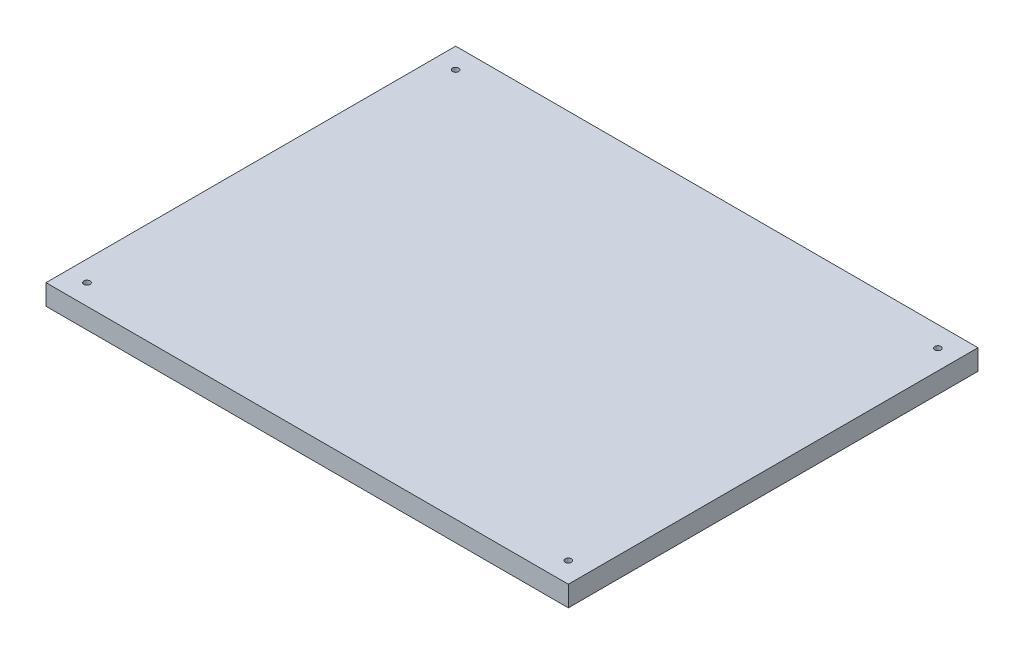
ISO-10303-21;
HEADER;
FILE_DESCRIPTION(('STEP AP214'),'2;1');
FILE_NAME('part.step','',(''),(''),'','','');
FILE_SCHEMA(('AUTOMOTIVE_DESIGN { 1 0 10303 214 1 1 1 1 }'));
ENDSEC;
DATA;
#1=APPLICATION_CONTEXT('core data for automotive mechanical design processes');
#2=APPLICATION_PROTOCOL_DEFINITION('international standard','automotive_design',2000,#1);
#3=PRODUCT_CONTEXT('',#1,'mechanical');
#4=PRODUCT('Part','Part','',(#3));
#5=PRODUCT_RELATED_PRODUCT_CATEGORY('part','',(#4));
#6=PRODUCT_DEFINITION_FORMATION('','',#4);
#7=PRODUCT_DEFINITION_CONTEXT('part definition',#1,'design');
#8=PRODUCT_DEFINITION('design','',#6,#7);
#9=PRODUCT_DEFINITION_SHAPE('','',#8);
#10=(LENGTH_UNIT() NAMED_UNIT(*) SI_UNIT(.MILLI.,.METRE.));
#11=(NAMED_UNIT(*) PLANE_ANGLE_UNIT() SI_UNIT($,.RADIAN.));
#12=(NAMED_UNIT(*) SI_UNIT($,.STERADIAN.) SOLID_ANGLE_UNIT());
#13=UNCERTAINTY_MEASURE_WITH_UNIT(LENGTH_MEASURE(1.E-05),#10,'distance_accuracy_value','');
#14=(GEOMETRIC_REPRESENTATION_CONTEXT(3) GLOBAL_UNCERTAINTY_ASSIGNED_CONTEXT((#13)) GLOBAL_UNIT_ASSIGNED_CONTEXT((#10,
#11,#12)) REPRESENTATION_CONTEXT('',''));
#15=CARTESIAN_POINT('',(0.,0.,0.));
#16=DIRECTION('',(0.,0.,1.));
#17=DIRECTION('',(1.,0.,0.));
#18=AXIS2_PLACEMENT_3D('',#15,#16,#17);
#19=CARTESIAN_POINT('',(127.5,10.,-100.));
#20=DIRECTION('',(0.,-1.,0.));
#21=DIRECTION('',(0.,0.,-1.));
#22=AXIS2_PLACEMENT_3D('',#19,#20,#21);
#23=PLANE('',#22);
#24=CARTESIAN_POINT('',(117.5,10.,90.));
#25=DIRECTION('',(0.,-1.,0.));
#26=DIRECTION('',(0.,0.,-1.));
#27=AXIS2_PLACEMENT_3D('',#24,#25,#26);
#28=CIRCLE('',#27,1.5);
#29=CARTESIAN_POINT('',(117.5,10.,88.5));
#30=VERTEX_POINT('',#29);
#31=EDGE_CURVE('E116',#30,#30,#28,.F.);
#32=ORIENTED_EDGE('',*,*,#31,.F.);
#33=EDGE_LOOP('',(#32));
#34=FACE_BOUND('',#33,.T.);
#35=CARTESIAN_POINT('',(-117.5,10.,-90.));
#36=DIRECTION('',(0.,-1.,0.));
#37=DIRECTION('',(0.,0.,-1.));
#38=AXIS2_PLACEMENT_3D('',#35,#36,#37);
#39=CIRCLE('',#38,1.5);
#40=CARTESIAN_POINT('',(-117.5,10.,-91.5));
#41=VERTEX_POINT('',#40);
#42=EDGE_CURVE('E104',#41,#41,#39,.F.);
#43=ORIENTED_EDGE('',*,*,#42,.F.);
#44=EDGE_LOOP('',(#43));
#45=FACE_BOUND('',#44,.T.);
#46=DIRECTION('',(0.,0.,-1.));
#47=VECTOR('',#46,1.);
#48=CARTESIAN_POINT('',(127.5,10.,100.));
#49=LINE('',#48,#47);
#50=CARTESIAN_POINT('',(127.5,10.,100.));
#51=VERTEX_POINT('',#50);
#52=CARTESIAN_POINT('',(127.5,10.,-100.));
#53=VERTEX_POINT('',#52);
#54=EDGE_CURVE('E88',#51,#53,#49,.T.);
#55=ORIENTED_EDGE('',*,*,#54,.T.);
#56=DIRECTION('',(-1.,0.,0.));
#57=VECTOR('',#56,1.);
#58=CARTESIAN_POINT('',(-127.5,10.,-100.));
#59=LINE('',#58,#57);
#60=CARTESIAN_POINT('',(-127.5,10.,-100.));
#61=VERTEX_POINT('',#60);
#62=EDGE_CURVE('E83',#53,#61,#59,.T.);
#63=ORIENTED_EDGE('',*,*,#62,.T.);
#64=DIRECTION('',(0.,0.,1.));
#65=VECTOR('',#64,1.);
#66=CARTESIAN_POINT('',(-127.5,10.,100.));
#67=LINE('',#66,#65);
#68=CARTESIAN_POINT('',(-127.5,10.,100.));
#69=VERTEX_POINT('',#68);
#70=EDGE_CURVE('E86',#61,#69,#67,.T.);
#71=ORIENTED_EDGE('',*,*,#70,.T.);
#72=DIRECTION('',(1.,0.,0.));
#73=VECTOR('',#72,1.);
#74=CARTESIAN_POINT('',(-127.5,10.,100.));
#75=LINE('',#74,#73);
#76=EDGE_CURVE('E53',#69,#51,#75,.T.);
#77=ORIENTED_EDGE('',*,*,#76,.T.);
#78=EDGE_LOOP('',(#55,#63,#71,#77));
#79=FACE_BOUND('',#78,.T.);
#80=CARTESIAN_POINT('',(117.904272166402,10.,-90.));
#81=DIRECTION('',(0.,-1.,0.));
#82=DIRECTION('',(0.,0.,-1.));
#83=AXIS2_PLACEMENT_3D('',#80,#81,#82);
#84=CIRCLE('',#83,1.5);
#85=CARTESIAN_POINT('',(117.904272166402,10.,-91.5));
#86=VERTEX_POINT('',#85);
#87=EDGE_CURVE('E113',#86,#86,#84,.F.);
#88=ORIENTED_EDGE('',*,*,#87,.F.);
#89=EDGE_LOOP('',(#88));
#90=FACE_BOUND('',#89,.T.);
#91=CARTESIAN_POINT('',(-117.5,10.,90.));
#92=DIRECTION('',(0.,-1.,0.));
#93=DIRECTION('',(0.,0.,-1.));
#94=AXIS2_PLACEMENT_3D('',#91,#92,#93);
#95=CIRCLE('',#94,1.5);
#96=CARTESIAN_POINT('',(-117.5,10.,88.5));
#97=VERTEX_POINT('',#96);
#98=EDGE_CURVE('E119',#97,#97,#95,.F.);
#99=ORIENTED_EDGE('',*,*,#98,.F.);
#100=EDGE_LOOP('',(#99));
#101=FACE_BOUND('',#100,.T.);
#102=ADVANCED_FACE('F34',(#34,#45,#79,#90,#101),#23,.F.);
#103=CARTESIAN_POINT('',(127.5,0.,-100.));
#104=DIRECTION('',(0.,-1.,0.));
#105=DIRECTION('',(0.,0.,-1.));
#106=AXIS2_PLACEMENT_3D('',#103,#104,#105);
#107=PLANE('',#106);
#108=CARTESIAN_POINT('',(117.5,0.,90.));
#109=DIRECTION('',(0.,-1.,0.));
#110=DIRECTION('',(0.,0.,-1.));
#111=AXIS2_PLACEMENT_3D('',#108,#109,#110);
#112=CIRCLE('',#111,1.5);
#113=CARTESIAN_POINT('',(117.5,0.,88.5));
#114=VERTEX_POINT('',#113);
#115=EDGE_CURVE('E117',#114,#114,#112,.F.);
#116=ORIENTED_EDGE('',*,*,#115,.T.);
#117=EDGE_LOOP('',(#116));
#118=FACE_BOUND('',#117,.T.);
#119=CARTESIAN_POINT('',(-117.5,0.,-90.));
#120=DIRECTION('',(0.,-1.,0.));
#121=DIRECTION('',(0.,0.,-1.));
#122=AXIS2_PLACEMENT_3D('',#119,#120,#121);
#123=CIRCLE('',#122,1.5);
#124=CARTESIAN_POINT('',(-117.5,0.,-91.5));
#125=VERTEX_POINT('',#124);
#126=EDGE_CURVE('E110',#125,#125,#123,.F.);
#127=ORIENTED_EDGE('',*,*,#126,.T.);
#128=EDGE_LOOP('',(#127));
#129=FACE_BOUND('',#128,.T.);
#130=DIRECTION('',(0.,0.,-1.));
#131=VECTOR('',#130,1.);
#132=CARTESIAN_POINT('',(127.5,0.,100.));
#133=LINE('',#132,#131);
#134=CARTESIAN_POINT('',(127.5,0.,100.));
#135=VERTEX_POINT('',#134);
#136=CARTESIAN_POINT('',(127.5,0.,-100.));
#137=VERTEX_POINT('',#136);
#138=EDGE_CURVE('E101',#135,#137,#133,.T.);
#139=ORIENTED_EDGE('',*,*,#138,.F.);
#140=DIRECTION('',(1.,0.,0.));
#141=VECTOR('',#140,1.);
#142=CARTESIAN_POINT('',(-127.5,0.,100.));
#143=LINE('',#142,#141);
#144=CARTESIAN_POINT('',(-127.5,0.,100.));
#145=VERTEX_POINT('',#144);
#146=EDGE_CURVE('E76',#145,#135,#143,.T.);
#147=ORIENTED_EDGE('',*,*,#146,.F.);
#148=DIRECTION('',(0.,0.,1.));
#149=VECTOR('',#148,1.);
#150=CARTESIAN_POINT('',(-127.5,0.,100.));
#151=LINE('',#150,#149);
#152=CARTESIAN_POINT('',(-127.5,0.,-100.));
#153=VERTEX_POINT('',#152);
#154=EDGE_CURVE('E70',#153,#145,#151,.T.);
#155=ORIENTED_EDGE('',*,*,#154,.F.);
#156=DIRECTION('',(-1.,0.,0.));
#157=VECTOR('',#156,1.);
#158=CARTESIAN_POINT('',(-127.5,0.,-100.));
#159=LINE('',#158,#157);
#160=EDGE_CURVE('E92',#137,#153,#159,.T.);
#161=ORIENTED_EDGE('',*,*,#160,.F.);
#162=EDGE_LOOP('',(#139,#147,#155,#161));
#163=FACE_BOUND('',#162,.T.);
#164=CARTESIAN_POINT('',(117.904272166402,0.,-90.));
#165=DIRECTION('',(0.,-1.,0.));
#166=DIRECTION('',(0.,0.,-1.));
#167=AXIS2_PLACEMENT_3D('',#164,#165,#166);
#168=CIRCLE('',#167,1.5);
#169=CARTESIAN_POINT('',(117.904272166402,0.,-91.5));
#170=VERTEX_POINT('',#169);
#171=EDGE_CURVE('E114',#170,#170,#168,.F.);
#172=ORIENTED_EDGE('',*,*,#171,.T.);
#173=EDGE_LOOP('',(#172));
#174=FACE_BOUND('',#173,.T.);
#175=CARTESIAN_POINT('',(-117.5,0.,90.));
#176=DIRECTION('',(0.,-1.,0.));
#177=DIRECTION('',(0.,0.,-1.));
#178=AXIS2_PLACEMENT_3D('',#175,#176,#177);
#179=CIRCLE('',#178,1.5);
#180=CARTESIAN_POINT('',(-117.5,0.,88.5));
#181=VERTEX_POINT('',#180);
#182=EDGE_CURVE('E38',#181,#181,#179,.F.);
#183=ORIENTED_EDGE('',*,*,#182,.T.);
#184=EDGE_LOOP('',(#183));
#185=FACE_BOUND('',#184,.T.);
#186=ADVANCED_FACE('F138',(#118,#129,#163,#174,#185),#107,.T.);
#187=CARTESIAN_POINT('',(127.5,10.,100.));
#188=DIRECTION('',(-1.,0.,0.));
#189=DIRECTION('',(0.,0.,1.));
#190=AXIS2_PLACEMENT_3D('',#187,#188,#189);
#191=PLANE('',#190);
#192=ORIENTED_EDGE('',*,*,#138,.T.);
#193=DIRECTION('',(0.,-1.,0.));
#194=VECTOR('',#193,1.);
#195=CARTESIAN_POINT('',(127.5,10.,-100.));
#196=LINE('',#195,#194);
#197=EDGE_CURVE('E11',#53,#137,#196,.T.);
#198=ORIENTED_EDGE('',*,*,#197,.F.);
#199=ORIENTED_EDGE('',*,*,#54,.F.);
#200=DIRECTION('',(0.,-1.,0.));
#201=VECTOR('',#200,1.);
#202=CARTESIAN_POINT('',(127.5,10.,100.));
#203=LINE('',#202,#201);
#204=EDGE_CURVE('E97',#51,#135,#203,.T.);
#205=ORIENTED_EDGE('',*,*,#204,.T.);
#206=EDGE_LOOP('',(#192,#198,#199,#205));
#207=FACE_BOUND('',#206,.T.);
#208=ADVANCED_FACE('F36',(#207),#191,.F.);
#209=CARTESIAN_POINT('',(-127.5,10.,-100.));
#210=DIRECTION('',(0.,0.,1.));
#211=DIRECTION('',(1.,0.,0.));
#212=AXIS2_PLACEMENT_3D('',#209,#210,#211);
#213=PLANE('',#212);
#214=ORIENTED_EDGE('',*,*,#160,.T.);
#215=DIRECTION('',(0.,-1.,0.));
#216=VECTOR('',#215,1.);
#217=CARTESIAN_POINT('',(-127.5,10.,-100.));
#218=LINE('',#217,#216);
#219=EDGE_CURVE('E44',#61,#153,#218,.T.);
#220=ORIENTED_EDGE('',*,*,#219,.F.);
#221=ORIENTED_EDGE('',*,*,#62,.F.);
#222=ORIENTED_EDGE('',*,*,#197,.T.);
#223=EDGE_LOOP('',(#214,#220,#221,#222));
#224=FACE_BOUND('',#223,.T.);
#225=ADVANCED_FACE('F91',(#224),#213,.F.);
#226=CARTESIAN_POINT('',(-127.5,10.,100.));
#227=DIRECTION('',(1.,0.,0.));
#228=DIRECTION('',(0.,0.,-1.));
#229=AXIS2_PLACEMENT_3D('',#226,#227,#228);
#230=PLANE('',#229);
#231=ORIENTED_EDGE('',*,*,#154,.T.);
#232=DIRECTION('',(0.,-1.,0.));
#233=VECTOR('',#232,1.);
#234=CARTESIAN_POINT('',(-127.5,10.,100.));
#235=LINE('',#234,#233);
#236=EDGE_CURVE('E93',#69,#145,#235,.T.);
#237=ORIENTED_EDGE('',*,*,#236,.F.);
#238=ORIENTED_EDGE('',*,*,#70,.F.);
#239=ORIENTED_EDGE('',*,*,#219,.T.);
#240=EDGE_LOOP('',(#231,#237,#238,#239));
#241=FACE_BOUND('',#240,.T.);
#242=ADVANCED_FACE('F95',(#241),#230,.F.);
#243=CARTESIAN_POINT('',(-127.5,10.,100.));
#244=DIRECTION('',(0.,0.,-1.));
#245=DIRECTION('',(-1.,0.,0.));
#246=AXIS2_PLACEMENT_3D('',#243,#244,#245);
#247=PLANE('',#246);
#248=ORIENTED_EDGE('',*,*,#146,.T.);
#249=ORIENTED_EDGE('',*,*,#204,.F.);
#250=ORIENTED_EDGE('',*,*,#76,.F.);
#251=ORIENTED_EDGE('',*,*,#236,.T.);
#252=EDGE_LOOP('',(#248,#249,#250,#251));
#253=FACE_BOUND('',#252,.T.);
#254=ADVANCED_FACE('F149',(#253),#247,.F.);
#255=CARTESIAN_POINT('',(-117.5,26.,-90.));
#256=DIRECTION('',(0.,-1.,0.));
#257=DIRECTION('',(0.,0.,-1.));
#258=AXIS2_PLACEMENT_3D('',#255,#256,#257);
#259=CYLINDRICAL_SURFACE('',#258,1.5);
#260=CARTESIAN_POINT('',(-117.5,0.,-91.5));
#261=CARTESIAN_POINT('',(-117.5,0.104166666666667,-91.5));
#262=CARTESIAN_POINT('',(-117.5,0.208333333333334,-91.5));
#263=CARTESIAN_POINT('',(-117.5,0.416666666666667,-91.5));
#264=CARTESIAN_POINT('',(-117.5,0.520833333333334,-91.5));
#265=CARTESIAN_POINT('',(-117.5,0.729166666666667,-91.5));
#266=CARTESIAN_POINT('',(-117.5,0.833333333333334,-91.5));
#267=CARTESIAN_POINT('',(-117.5,1.04166666666667,-91.5));
#268=CARTESIAN_POINT('',(-117.5,1.14583333333333,-91.5));
#269=CARTESIAN_POINT('',(-117.5,1.35416666666667,-91.5));
#270=CARTESIAN_POINT('',(-117.5,1.45833333333333,-91.5));
#271=CARTESIAN_POINT('',(-117.5,1.66666666666667,-91.5));
#272=CARTESIAN_POINT('',(-117.5,1.77083333333334,-91.5));
#273=CARTESIAN_POINT('',(-117.5,1.97916666666667,-91.5));
#274=CARTESIAN_POINT('',(-117.5,2.08333333333334,-91.5));
#275=CARTESIAN_POINT('',(-117.5,2.29166666666667,-91.5));
#276=CARTESIAN_POINT('',(-117.5,2.39583333333334,-91.5));
#277=CARTESIAN_POINT('',(-117.5,2.60416666666667,-91.5));
#278=CARTESIAN_POINT('',(-117.5,2.70833333333334,-91.5));
#279=CARTESIAN_POINT('',(-117.5,2.91666666666667,-91.5));
#280=CARTESIAN_POINT('',(-117.5,3.02083333333333,-91.5));
#281=CARTESIAN_POINT('',(-117.5,3.22916666666667,-91.5));
#282=CARTESIAN_POINT('',(-117.5,3.33333333333333,-91.5));
#283=CARTESIAN_POINT('',(-117.5,3.54166666666667,-91.5));
#284=CARTESIAN_POINT('',(-117.5,3.64583333333333,-91.5));
#285=CARTESIAN_POINT('',(-117.5,3.85416666666667,-91.5));
#286=CARTESIAN_POINT('',(-117.5,3.95833333333333,-91.5));
#287=CARTESIAN_POINT('',(-117.5,4.16666666666667,-91.5));
#288=CARTESIAN_POINT('',(-117.5,4.27083333333333,-91.5));
#289=CARTESIAN_POINT('',(-117.5,4.47916666666667,-91.5));
#290=CARTESIAN_POINT('',(-117.5,4.58333333333333,-91.5));
#291=CARTESIAN_POINT('',(-117.5,4.79166666666667,-91.5));
#292=CARTESIAN_POINT('',(-117.5,4.89583333333333,-91.5));
#293=CARTESIAN_POINT('',(-117.5,5.10416666666667,-91.5));
#294=CARTESIAN_POINT('',(-117.5,5.20833333333333,-91.5));
#295=CARTESIAN_POINT('',(-117.5,5.41666666666667,-91.5));
#296=CARTESIAN_POINT('',(-117.5,5.52083333333333,-91.5));
#297=CARTESIAN_POINT('',(-117.5,5.72916666666667,-91.5));
#298=CARTESIAN_POINT('',(-117.5,5.83333333333334,-91.5));
#299=CARTESIAN_POINT('',(-117.5,6.04166666666667,-91.5));
#300=CARTESIAN_POINT('',(-117.5,6.14583333333334,-91.5));
#301=CARTESIAN_POINT('',(-117.5,6.35416666666667,-91.5));
#302=CARTESIAN_POINT('',(-117.5,6.45833333333334,-91.5));
#303=CARTESIAN_POINT('',(-117.5,6.66666666666667,-91.5));
#304=CARTESIAN_POINT('',(-117.5,6.77083333333333,-91.5));
#305=CARTESIAN_POINT('',(-117.5,6.97916666666667,-91.5));
#306=CARTESIAN_POINT('',(-117.5,7.08333333333333,-91.5));
#307=CARTESIAN_POINT('',(-117.5,7.29166666666667,-91.5));
#308=CARTESIAN_POINT('',(-117.5,7.39583333333333,-91.5));
#309=CARTESIAN_POINT('',(-117.5,7.60416666666667,-91.5));
#310=CARTESIAN_POINT('',(-117.5,7.70833333333333,-91.5));
#311=CARTESIAN_POINT('',(-117.5,7.91666666666667,-91.5));
#312=CARTESIAN_POINT('',(-117.5,8.02083333333333,-91.5));
#313=CARTESIAN_POINT('',(-117.5,8.22916666666667,-91.5));
#314=CARTESIAN_POINT('',(-117.5,8.33333333333333,-91.5));
#315=CARTESIAN_POINT('',(-117.5,8.54166666666667,-91.5));
#316=CARTESIAN_POINT('',(-117.5,8.64583333333333,-91.5));
#317=CARTESIAN_POINT('',(-117.5,8.85416666666667,-91.5));
#318=CARTESIAN_POINT('',(-117.5,8.95833333333333,-91.5));
#319=CARTESIAN_POINT('',(-117.5,9.16666666666667,-91.5));
#320=CARTESIAN_POINT('',(-117.5,9.27083333333333,-91.5));
#321=CARTESIAN_POINT('',(-117.5,9.47916666666667,-91.5));
#322=CARTESIAN_POINT('',(-117.5,9.58333333333333,-91.5));
#323=CARTESIAN_POINT('',(-117.5,9.79166666666667,-91.5));
#324=CARTESIAN_POINT('',(-117.5,9.89583333333333,-91.5));
#325=CARTESIAN_POINT('',(-117.5,10.,-91.5));
#326=B_SPLINE_CURVE_WITH_KNOTS('',3,(#260,#261,#262,#263,#264,#265,#266,#267,#268,#269,#270,
#271,#272,#273,#274,#275,#276,#277,#278,#279,#280,#281,#282,#283,#284,#285,#286,#287,#288,#289,
#290,#291,#292,#293,#294,#295,#296,#297,#298,#299,#300,#301,#302,#303,#304,#305,#306,#307,#308,
#309,#310,#311,#312,#313,#314,#315,#316,#317,#318,#319,#320,#321,#322,#323,#324,#325),
.UNSPECIFIED.,.F.,.F.,(4,2,2,2,2,2,2,2,2,2,2,2,2,2,2,2,2,2,2,2,2,2,2,2,2,2,2,2,2,2,2,2,4),(0.,
0.3125,0.625000000000001,0.937500000000001,1.25,1.5625,1.875,2.1875,2.5,2.8125,3.125,3.4375,
3.75,4.0625,4.375,4.6875,5.,5.3125,5.625,5.9375,6.25,6.5625,6.875,7.1875,7.5,7.8125,8.125,
8.4375,8.75,9.0625,9.375,9.6875,10.),.UNSPECIFIED.);
#327=EDGE_CURVE('BSEAM135',#125,#41,#326,.T.);
#328=ORIENTED_EDGE('',*,*,#126,.F.);
#329=ORIENTED_EDGE('',*,*,#42,.T.);
#330=ORIENTED_EDGE('',*,*,#327,.T.);
#331=ORIENTED_EDGE('',*,*,#327,.F.);
#332=EDGE_LOOP('',(#328,#330,#329,#331));
#333=FACE_BOUND('',#332,.T.);
#334=ADVANCED_FACE('F135',(#333),#259,.F.);
#335=CARTESIAN_POINT('',(117.904272166402,26.,-90.));
#336=DIRECTION('',(0.,-1.,0.));
#337=DIRECTION('',(0.,0.,-1.));
#338=AXIS2_PLACEMENT_3D('',#335,#336,#337);
#339=CYLINDRICAL_SURFACE('',#338,1.5);
#340=CARTESIAN_POINT('',(117.904272166402,0.,-91.5));
#341=CARTESIAN_POINT('',(117.904272166402,0.104166666666667,-91.5));
#342=CARTESIAN_POINT('',(117.904272166402,0.208333333333334,-91.5));
#343=CARTESIAN_POINT('',(117.904272166402,0.416666666666667,-91.5));
#344=CARTESIAN_POINT('',(117.904272166402,0.520833333333334,-91.5));
#345=CARTESIAN_POINT('',(117.904272166402,0.729166666666667,-91.5));
#346=CARTESIAN_POINT('',(117.904272166402,0.833333333333334,-91.5));
#347=CARTESIAN_POINT('',(117.904272166402,1.04166666666667,-91.5));
#348=CARTESIAN_POINT('',(117.904272166402,1.14583333333333,-91.5));
#349=CARTESIAN_POINT('',(117.904272166402,1.35416666666667,-91.5));
#350=CARTESIAN_POINT('',(117.904272166402,1.45833333333333,-91.5));
#351=CARTESIAN_POINT('',(117.904272166402,1.66666666666667,-91.5));
#352=CARTESIAN_POINT('',(117.904272166402,1.77083333333334,-91.5));
#353=CARTESIAN_POINT('',(117.904272166402,1.97916666666667,-91.5));
#354=CARTESIAN_POINT('',(117.904272166402,2.08333333333334,-91.5));
#355=CARTESIAN_POINT('',(117.904272166402,2.29166666666667,-91.5));
#356=CARTESIAN_POINT('',(117.904272166402,2.39583333333334,-91.5));
#357=CARTESIAN_POINT('',(117.904272166402,2.60416666666667,-91.5));
#358=CARTESIAN_POINT('',(117.904272166402,2.70833333333334,-91.5));
#359=CARTESIAN_POINT('',(117.904272166402,2.91666666666667,-91.5));
#360=CARTESIAN_POINT('',(117.904272166402,3.02083333333333,-91.5));
#361=CARTESIAN_POINT('',(117.904272166402,3.22916666666667,-91.5));
#362=CARTESIAN_POINT('',(117.904272166402,3.33333333333333,-91.5));
#363=CARTESIAN_POINT('',(117.904272166402,3.54166666666667,-91.5));
#364=CARTESIAN_POINT('',(117.904272166402,3.64583333333333,-91.5));
#365=CARTESIAN_POINT('',(117.904272166402,3.85416666666667,-91.5));
#366=CARTESIAN_POINT('',(117.904272166402,3.95833333333333,-91.5));
#367=CARTESIAN_POINT('',(117.904272166402,4.16666666666667,-91.5));
#368=CARTESIAN_POINT('',(117.904272166402,4.27083333333333,-91.5));
#369=CARTESIAN_POINT('',(117.904272166402,4.47916666666667,-91.5));
#370=CARTESIAN_POINT('',(117.904272166402,4.58333333333333,-91.5));
#371=CARTESIAN_POINT('',(117.904272166402,4.79166666666667,-91.5));
#372=CARTESIAN_POINT('',(117.904272166402,4.89583333333333,-91.5));
#373=CARTESIAN_POINT('',(117.904272166402,5.10416666666667,-91.5));
#374=CARTESIAN_POINT('',(117.904272166402,5.20833333333333,-91.5));
#375=CARTESIAN_POINT('',(117.904272166402,5.41666666666667,-91.5));
#376=CARTESIAN_POINT('',(117.904272166402,5.52083333333333,-91.5));
#377=CARTESIAN_POINT('',(117.904272166402,5.72916666666667,-91.5));
#378=CARTESIAN_POINT('',(117.904272166402,5.83333333333334,-91.5));
#379=CARTESIAN_POINT('',(117.904272166402,6.04166666666667,-91.5));
#380=CARTESIAN_POINT('',(117.904272166402,6.14583333333334,-91.5));
#381=CARTESIAN_POINT('',(117.904272166402,6.35416666666667,-91.5));
#382=CARTESIAN_POINT('',(117.904272166402,6.45833333333334,-91.5));
#383=CARTESIAN_POINT('',(117.904272166402,6.66666666666667,-91.5));
#384=CARTESIAN_POINT('',(117.904272166402,6.77083333333333,-91.5));
#385=CARTESIAN_POINT('',(117.904272166402,6.97916666666667,-91.5));
#386=CARTESIAN_POINT('',(117.904272166402,7.08333333333333,-91.5));
#387=CARTESIAN_POINT('',(117.904272166402,7.29166666666667,-91.5));
#388=CARTESIAN_POINT('',(117.904272166402,7.39583333333333,-91.5));
#389=CARTESIAN_POINT('',(117.904272166402,7.60416666666667,-91.5));
#390=CARTESIAN_POINT('',(117.904272166402,7.70833333333333,-91.5));
#391=CARTESIAN_POINT('',(117.904272166402,7.91666666666667,-91.5));
#392=CARTESIAN_POINT('',(117.904272166402,8.02083333333333,-91.5));
#393=CARTESIAN_POINT('',(117.904272166402,8.22916666666667,-91.5));
#394=CARTESIAN_POINT('',(117.904272166402,8.33333333333333,-91.5));
#395=CARTESIAN_POINT('',(117.904272166402,8.54166666666667,-91.5));
#396=CARTESIAN_POINT('',(117.904272166402,8.64583333333333,-91.5));
#397=CARTESIAN_POINT('',(117.904272166402,8.85416666666667,-91.5));
#398=CARTESIAN_POINT('',(117.904272166402,8.95833333333333,-91.5));
#399=CARTESIAN_POINT('',(117.904272166402,9.16666666666667,-91.5));
#400=CARTESIAN_POINT('',(117.904272166402,9.27083333333333,-91.5));
#401=CARTESIAN_POINT('',(117.904272166402,9.47916666666667,-91.5));
#402=CARTESIAN_POINT('',(117.904272166402,9.58333333333333,-91.5));
#403=CARTESIAN_POINT('',(117.904272166402,9.79166666666667,-91.5));
#404=CARTESIAN_POINT('',(117.904272166402,9.89583333333333,-91.5));
#405=CARTESIAN_POINT('',(117.904272166402,10.,-91.5));
#406=B_SPLINE_CURVE_WITH_KNOTS('',3,(#340,#341,#342,#343,#344,#345,#346,#347,#348,#349,#350,
#351,#352,#353,#354,#355,#356,#357,#358,#359,#360,#361,#362,#363,#364,#365,#366,#367,#368,#369,
#370,#371,#372,#373,#374,#375,#376,#377,#378,#379,#380,#381,#382,#383,#384,#385,#386,#387,#388,
#389,#390,#391,#392,#393,#394,#395,#396,#397,#398,#399,#400,#401,#402,#403,#404,#405),
.UNSPECIFIED.,.F.,.F.,(4,2,2,2,2,2,2,2,2,2,2,2,2,2,2,2,2,2,2,2,2,2,2,2,2,2,2,2,2,2,2,2,4),(0.,
0.3125,0.625000000000001,0.937500000000001,1.25,1.5625,1.875,2.1875,2.5,2.8125,3.125,3.4375,
3.75,4.0625,4.375,4.6875,5.,5.3125,5.625,5.9375,6.25,6.5625,6.875,7.1875,7.5,7.8125,8.125,
8.4375,8.75,9.0625,9.375,9.6875,10.),.UNSPECIFIED.);
#407=EDGE_CURVE('BSEAM174',#170,#86,#406,.T.);
#408=ORIENTED_EDGE('',*,*,#171,.F.);
#409=ORIENTED_EDGE('',*,*,#87,.T.);
#410=ORIENTED_EDGE('',*,*,#407,.T.);
#411=ORIENTED_EDGE('',*,*,#407,.F.);
#412=EDGE_LOOP('',(#408,#410,#409,#411));
#413=FACE_BOUND('',#412,.T.);
#414=ADVANCED_FACE('F174',(#413),#339,.F.);
#415=CARTESIAN_POINT('',(117.5,26.,90.));
#416=DIRECTION('',(0.,-1.,0.));
#417=DIRECTION('',(0.,0.,-1.));
#418=AXIS2_PLACEMENT_3D('',#415,#416,#417);
#419=CYLINDRICAL_SURFACE('',#418,1.5);
#420=CARTESIAN_POINT('',(117.5,0.,88.5));
#421=CARTESIAN_POINT('',(117.5,0.104166666666667,88.5));
#422=CARTESIAN_POINT('',(117.5,0.208333333333334,88.5));
#423=CARTESIAN_POINT('',(117.5,0.416666666666667,88.5));
#424=CARTESIAN_POINT('',(117.5,0.520833333333334,88.5));
#425=CARTESIAN_POINT('',(117.5,0.729166666666667,88.5));
#426=CARTESIAN_POINT('',(117.5,0.833333333333334,88.5));
#427=CARTESIAN_POINT('',(117.5,1.04166666666667,88.5));
#428=CARTESIAN_POINT('',(117.5,1.14583333333333,88.5));
#429=CARTESIAN_POINT('',(117.5,1.35416666666667,88.5));
#430=CARTESIAN_POINT('',(117.5,1.45833333333333,88.5));
#431=CARTESIAN_POINT('',(117.5,1.66666666666667,88.5));
#432=CARTESIAN_POINT('',(117.5,1.77083333333334,88.5));
#433=CARTESIAN_POINT('',(117.5,1.97916666666667,88.5));
#434=CARTESIAN_POINT('',(117.5,2.08333333333334,88.5));
#435=CARTESIAN_POINT('',(117.5,2.29166666666667,88.5));
#436=CARTESIAN_POINT('',(117.5,2.39583333333334,88.5));
#437=CARTESIAN_POINT('',(117.5,2.60416666666667,88.5));
#438=CARTESIAN_POINT('',(117.5,2.70833333333334,88.5));
#439=CARTESIAN_POINT('',(117.5,2.91666666666667,88.5));
#440=CARTESIAN_POINT('',(117.5,3.02083333333333,88.5));
#441=CARTESIAN_POINT('',(117.5,3.22916666666667,88.5));
#442=CARTESIAN_POINT('',(117.5,3.33333333333333,88.5));
#443=CARTESIAN_POINT('',(117.5,3.54166666666667,88.5));
#444=CARTESIAN_POINT('',(117.5,3.64583333333333,88.5));
#445=CARTESIAN_POINT('',(117.5,3.85416666666667,88.5));
#446=CARTESIAN_POINT('',(117.5,3.95833333333333,88.5));
#447=CARTESIAN_POINT('',(117.5,4.16666666666667,88.5));
#448=CARTESIAN_POINT('',(117.5,4.27083333333333,88.5));
#449=CARTESIAN_POINT('',(117.5,4.47916666666667,88.5));
#450=CARTESIAN_POINT('',(117.5,4.58333333333333,88.5));
#451=CARTESIAN_POINT('',(117.5,4.79166666666667,88.5));
#452=CARTESIAN_POINT('',(117.5,4.89583333333333,88.5));
#453=CARTESIAN_POINT('',(117.5,5.10416666666667,88.5));
#454=CARTESIAN_POINT('',(117.5,5.20833333333333,88.5));
#455=CARTESIAN_POINT('',(117.5,5.41666666666667,88.5));
#456=CARTESIAN_POINT('',(117.5,5.52083333333333,88.5));
#457=CARTESIAN_POINT('',(117.5,5.72916666666667,88.5));
#458=CARTESIAN_POINT('',(117.5,5.83333333333334,88.5));
#459=CARTESIAN_POINT('',(117.5,6.04166666666667,88.5));
#460=CARTESIAN_POINT('',(117.5,6.14583333333334,88.5));
#461=CARTESIAN_POINT('',(117.5,6.35416666666667,88.5));
#462=CARTESIAN_POINT('',(117.5,6.45833333333334,88.5));
#463=CARTESIAN_POINT('',(117.5,6.66666666666667,88.5));
#464=CARTESIAN_POINT('',(117.5,6.77083333333333,88.5));
#465=CARTESIAN_POINT('',(117.5,6.97916666666667,88.5));
#466=CARTESIAN_POINT('',(117.5,7.08333333333333,88.5));
#467=CARTESIAN_POINT('',(117.5,7.29166666666667,88.5));
#468=CARTESIAN_POINT('',(117.5,7.39583333333333,88.5));
#469=CARTESIAN_POINT('',(117.5,7.60416666666667,88.5));
#470=CARTESIAN_POINT('',(117.5,7.70833333333333,88.5));
#471=CARTESIAN_POINT('',(117.5,7.91666666666667,88.5));
#472=CARTESIAN_POINT('',(117.5,8.02083333333333,88.5));
#473=CARTESIAN_POINT('',(117.5,8.22916666666667,88.5));
#474=CARTESIAN_POINT('',(117.5,8.33333333333333,88.5));
#475=CARTESIAN_POINT('',(117.5,8.54166666666667,88.5));
#476=CARTESIAN_POINT('',(117.5,8.64583333333333,88.5));
#477=CARTESIAN_POINT('',(117.5,8.85416666666667,88.5));
#478=CARTESIAN_POINT('',(117.5,8.95833333333333,88.5));
#479=CARTESIAN_POINT('',(117.5,9.16666666666667,88.5));
#480=CARTESIAN_POINT('',(117.5,9.27083333333333,88.5));
#481=CARTESIAN_POINT('',(117.5,9.47916666666667,88.5));
#482=CARTESIAN_POINT('',(117.5,9.58333333333333,88.5));
#483=CARTESIAN_POINT('',(117.5,9.79166666666667,88.5));
#484=CARTESIAN_POINT('',(117.5,9.89583333333333,88.5));
#485=CARTESIAN_POINT('',(117.5,10.,88.5));
#486=B_SPLINE_CURVE_WITH_KNOTS('',3,(#420,#421,#422,#423,#424,#425,#426,#427,#428,#429,#430,
#431,#432,#433,#434,#435,#436,#437,#438,#439,#440,#441,#442,#443,#444,#445,#446,#447,#448,#449,
#450,#451,#452,#453,#454,#455,#456,#457,#458,#459,#460,#461,#462,#463,#464,#465,#466,#467,#468,
#469,#470,#471,#472,#473,#474,#475,#476,#477,#478,#479,#480,#481,#482,#483,#484,#485),
.UNSPECIFIED.,.F.,.F.,(4,2,2,2,2,2,2,2,2,2,2,2,2,2,2,2,2,2,2,2,2,2,2,2,2,2,2,2,2,2,2,2,4),(0.,
0.3125,0.625000000000001,0.937500000000001,1.25,1.5625,1.875,2.1875,2.5,2.8125,3.125,3.4375,
3.75,4.0625,4.375,4.6875,5.,5.3125,5.625,5.9375,6.25,6.5625,6.875,7.1875,7.5,7.8125,8.125,
8.4375,8.75,9.0625,9.375,9.6875,10.),.UNSPECIFIED.);
#487=EDGE_CURVE('BSEAM169',#114,#30,#486,.T.);
#488=ORIENTED_EDGE('',*,*,#115,.F.);
#489=ORIENTED_EDGE('',*,*,#31,.T.);
#490=ORIENTED_EDGE('',*,*,#487,.T.);
#491=ORIENTED_EDGE('',*,*,#487,.F.);
#492=EDGE_LOOP('',(#488,#490,#489,#491));
#493=FACE_BOUND('',#492,.T.);
#494=ADVANCED_FACE('F169',(#493),#419,.F.);
#495=CARTESIAN_POINT('',(-117.5,26.,90.));
#496=DIRECTION('',(0.,-1.,0.));
#497=DIRECTION('',(0.,0.,-1.));
#498=AXIS2_PLACEMENT_3D('',#495,#496,#497);
#499=CYLINDRICAL_SURFACE('',#498,1.5);
#500=CARTESIAN_POINT('',(-117.5,0.,88.5));
#501=CARTESIAN_POINT('',(-117.5,0.104166666666667,88.5));
#502=CARTESIAN_POINT('',(-117.5,0.208333333333334,88.5));
#503=CARTESIAN_POINT('',(-117.5,0.416666666666667,88.5));
#504=CARTESIAN_POINT('',(-117.5,0.520833333333334,88.5));
#505=CARTESIAN_POINT('',(-117.5,0.729166666666667,88.5));
#506=CARTESIAN_POINT('',(-117.5,0.833333333333334,88.5));
#507=CARTESIAN_POINT('',(-117.5,1.04166666666667,88.5));
#508=CARTESIAN_POINT('',(-117.5,1.14583333333333,88.5));
#509=CARTESIAN_POINT('',(-117.5,1.35416666666667,88.5));
#510=CARTESIAN_POINT('',(-117.5,1.45833333333333,88.5));
#511=CARTESIAN_POINT('',(-117.5,1.66666666666667,88.5));
#512=CARTESIAN_POINT('',(-117.5,1.77083333333334,88.5));
#513=CARTESIAN_POINT('',(-117.5,1.97916666666667,88.5));
#514=CARTESIAN_POINT('',(-117.5,2.08333333333334,88.5));
#515=CARTESIAN_POINT('',(-117.5,2.29166666666667,88.5));
#516=CARTESIAN_POINT('',(-117.5,2.39583333333334,88.5));
#517=CARTESIAN_POINT('',(-117.5,2.60416666666667,88.5));
#518=CARTESIAN_POINT('',(-117.5,2.70833333333334,88.5));
#519=CARTESIAN_POINT('',(-117.5,2.91666666666667,88.5));
#520=CARTESIAN_POINT('',(-117.5,3.02083333333333,88.5));
#521=CARTESIAN_POINT('',(-117.5,3.22916666666667,88.5));
#522=CARTESIAN_POINT('',(-117.5,3.33333333333333,88.5));
#523=CARTESIAN_POINT('',(-117.5,3.54166666666667,88.5));
#524=CARTESIAN_POINT('',(-117.5,3.64583333333333,88.5));
#525=CARTESIAN_POINT('',(-117.5,3.85416666666667,88.5));
#526=CARTESIAN_POINT('',(-117.5,3.95833333333333,88.5));
#527=CARTESIAN_POINT('',(-117.5,4.16666666666667,88.5));
#528=CARTESIAN_POINT('',(-117.5,4.27083333333333,88.5));
#529=CARTESIAN_POINT('',(-117.5,4.47916666666667,88.5));
#530=CARTESIAN_POINT('',(-117.5,4.58333333333333,88.5));
#531=CARTESIAN_POINT('',(-117.5,4.79166666666667,88.5));
#532=CARTESIAN_POINT('',(-117.5,4.89583333333333,88.5));
#533=CARTESIAN_POINT('',(-117.5,5.10416666666667,88.5));
#534=CARTESIAN_POINT('',(-117.5,5.20833333333333,88.5));
#535=CARTESIAN_POINT('',(-117.5,5.41666666666667,88.5));
#536=CARTESIAN_POINT('',(-117.5,5.52083333333333,88.5));
#537=CARTESIAN_POINT('',(-117.5,5.72916666666667,88.5));
#538=CARTESIAN_POINT('',(-117.5,5.83333333333334,88.5));
#539=CARTESIAN_POINT('',(-117.5,6.04166666666667,88.5));
#540=CARTESIAN_POINT('',(-117.5,6.14583333333334,88.5));
#541=CARTESIAN_POINT('',(-117.5,6.35416666666667,88.5));
#542=CARTESIAN_POINT('',(-117.5,6.45833333333334,88.5));
#543=CARTESIAN_POINT('',(-117.5,6.66666666666667,88.5));
#544=CARTESIAN_POINT('',(-117.5,6.77083333333333,88.5));
#545=CARTESIAN_POINT('',(-117.5,6.97916666666667,88.5));
#546=CARTESIAN_POINT('',(-117.5,7.08333333333333,88.5));
#547=CARTESIAN_POINT('',(-117.5,7.29166666666667,88.5));
#548=CARTESIAN_POINT('',(-117.5,7.39583333333333,88.5));
#549=CARTESIAN_POINT('',(-117.5,7.60416666666667,88.5));
#550=CARTESIAN_POINT('',(-117.5,7.70833333333333,88.5));
#551=CARTESIAN_POINT('',(-117.5,7.91666666666667,88.5));
#552=CARTESIAN_POINT('',(-117.5,8.02083333333333,88.5));
#553=CARTESIAN_POINT('',(-117.5,8.22916666666667,88.5));
#554=CARTESIAN_POINT('',(-117.5,8.33333333333333,88.5));
#555=CARTESIAN_POINT('',(-117.5,8.54166666666667,88.5));
#556=CARTESIAN_POINT('',(-117.5,8.64583333333333,88.5));
#557=CARTESIAN_POINT('',(-117.5,8.85416666666667,88.5));
#558=CARTESIAN_POINT('',(-117.5,8.95833333333333,88.5));
#559=CARTESIAN_POINT('',(-117.5,9.16666666666667,88.5));
#560=CARTESIAN_POINT('',(-117.5,9.27083333333333,88.5));
#561=CARTESIAN_POINT('',(-117.5,9.47916666666667,88.5));
#562=CARTESIAN_POINT('',(-117.5,9.58333333333333,88.5));
#563=CARTESIAN_POINT('',(-117.5,9.79166666666667,88.5));
#564=CARTESIAN_POINT('',(-117.5,9.89583333333333,88.5));
#565=CARTESIAN_POINT('',(-117.5,10.,88.5));
#566=B_SPLINE_CURVE_WITH_KNOTS('',3,(#500,#501,#502,#503,#504,#505,#506,#507,#508,#509,#510,
#511,#512,#513,#514,#515,#516,#517,#518,#519,#520,#521,#522,#523,#524,#525,#526,#527,#528,#529,
#530,#531,#532,#533,#534,#535,#536,#537,#538,#539,#540,#541,#542,#543,#544,#545,#546,#547,#548,
#549,#550,#551,#552,#553,#554,#555,#556,#557,#558,#559,#560,#561,#562,#563,#564,#565),
.UNSPECIFIED.,.F.,.F.,(4,2,2,2,2,2,2,2,2,2,2,2,2,2,2,2,2,2,2,2,2,2,2,2,2,2,2,2,2,2,2,2,4),(0.,
0.3125,0.625000000000001,0.937500000000001,1.25,1.5625,1.875,2.1875,2.5,2.8125,3.125,3.4375,
3.75,4.0625,4.375,4.6875,5.,5.3125,5.625,5.9375,6.25,6.5625,6.875,7.1875,7.5,7.8125,8.125,
8.4375,8.75,9.0625,9.375,9.6875,10.),.UNSPECIFIED.);
#567=EDGE_CURVE('BSEAM167',#181,#97,#566,.T.);
#568=ORIENTED_EDGE('',*,*,#182,.F.);
#569=ORIENTED_EDGE('',*,*,#98,.T.);
#570=ORIENTED_EDGE('',*,*,#567,.T.);
#571=ORIENTED_EDGE('',*,*,#567,.F.);
#572=EDGE_LOOP('',(#568,#570,#569,#571));
#573=FACE_BOUND('',#572,.T.);
#574=ADVANCED_FACE('F167',(#573),#499,.F.);
#575=CLOSED_SHELL('',(#102,#186,#208,#225,#242,#254,#334,#414,#494,#574));
#576=MANIFOLD_SOLID_BREP('B2',#575);
#577=ADVANCED_BREP_SHAPE_REPRESENTATION('',(#18,#576),#14);
#578=SHAPE_DEFINITION_REPRESENTATION(#9,#577);
ENDSEC;
END-ISO-10303-21;
